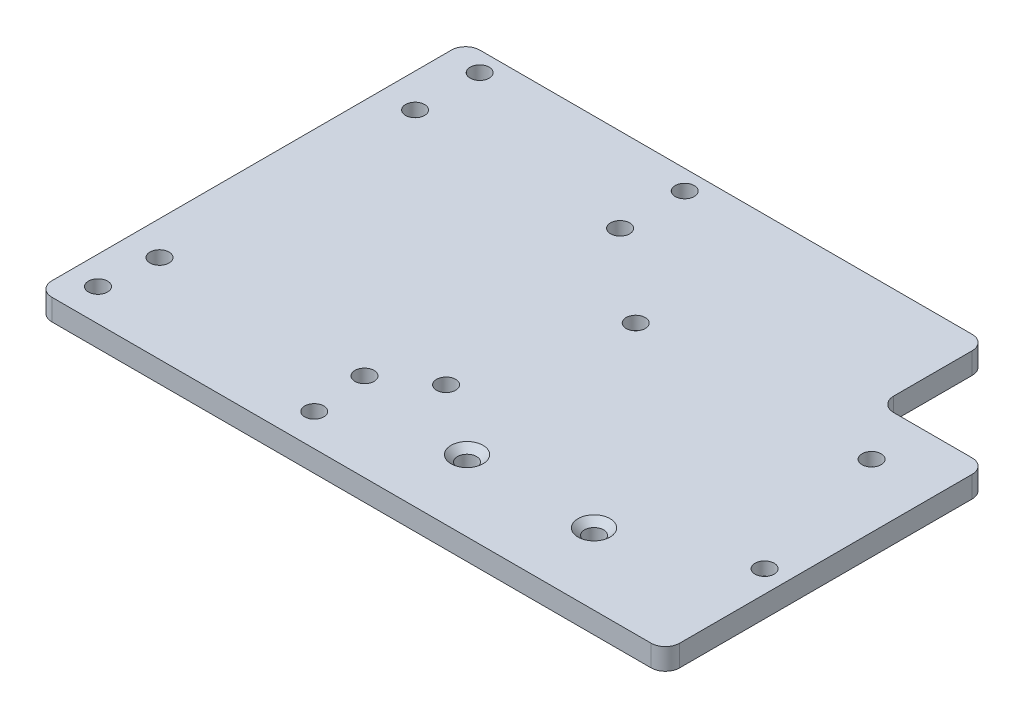
ISO-10303-21;
HEADER;
FILE_DESCRIPTION(('STEP AP214'),'2;1');
FILE_NAME('part.step','',(''),(''),'','','');
FILE_SCHEMA(('AUTOMOTIVE_DESIGN { 1 0 10303 214 1 1 1 1 }'));
ENDSEC;
DATA;
#1=APPLICATION_CONTEXT('core data for automotive mechanical design processes');
#2=APPLICATION_PROTOCOL_DEFINITION('international standard','automotive_design',2000,#1);
#3=PRODUCT_CONTEXT('',#1,'mechanical');
#4=PRODUCT('Part','Part','',(#3));
#5=PRODUCT_RELATED_PRODUCT_CATEGORY('part','',(#4));
#6=PRODUCT_DEFINITION_FORMATION('','',#4);
#7=PRODUCT_DEFINITION_CONTEXT('part definition',#1,'design');
#8=PRODUCT_DEFINITION('design','',#6,#7);
#9=PRODUCT_DEFINITION_SHAPE('','',#8);
#10=(LENGTH_UNIT() NAMED_UNIT(*) SI_UNIT(.MILLI.,.METRE.));
#11=(NAMED_UNIT(*) PLANE_ANGLE_UNIT() SI_UNIT($,.RADIAN.));
#12=(NAMED_UNIT(*) SI_UNIT($,.STERADIAN.) SOLID_ANGLE_UNIT());
#13=UNCERTAINTY_MEASURE_WITH_UNIT(LENGTH_MEASURE(1.E-05),#10,'distance_accuracy_value','');
#14=(GEOMETRIC_REPRESENTATION_CONTEXT(3) GLOBAL_UNCERTAINTY_ASSIGNED_CONTEXT((#13)) GLOBAL_UNIT_ASSIGNED_CONTEXT((#10,
#11,#12)) REPRESENTATION_CONTEXT('',''));
#15=CARTESIAN_POINT('',(0.,0.,0.));
#16=DIRECTION('',(0.,0.,1.));
#17=DIRECTION('',(1.,0.,0.));
#18=AXIS2_PLACEMENT_3D('',#15,#16,#17);
#19=CARTESIAN_POINT('',(55.88,1.905,38.1));
#20=DIRECTION('',(-1.,0.,0.));
#21=DIRECTION('',(0.,0.,1.));
#22=AXIS2_PLACEMENT_3D('',#19,#20,#21);
#23=PLANE('',#22);
#24=DIRECTION('',(0.,0.,-1.));
#25=VECTOR('',#24,1.);
#26=CARTESIAN_POINT('',(55.88,-1.905,38.1));
#27=LINE('',#26,#25);
#28=CARTESIAN_POINT('',(55.88,-1.905,35.56));
#29=VERTEX_POINT('',#28);
#30=CARTESIAN_POINT('',(55.88,-1.905,-16.51));
#31=VERTEX_POINT('',#30);
#32=EDGE_CURVE('E139',#29,#31,#27,.T.);
#33=ORIENTED_EDGE('',*,*,#32,.T.);
#34=DIRECTION('',(0.,1.,0.));
#35=VECTOR('',#34,1.);
#36=CARTESIAN_POINT('',(55.88,1.905,-16.51));
#37=LINE('',#36,#35);
#38=CARTESIAN_POINT('',(55.88,1.905,-16.51));
#39=VERTEX_POINT('',#38);
#40=EDGE_CURVE('E186',#31,#39,#37,.T.);
#41=ORIENTED_EDGE('',*,*,#40,.T.);
#42=DIRECTION('',(0.,0.,-1.));
#43=VECTOR('',#42,1.);
#44=CARTESIAN_POINT('',(55.88,1.905,38.1));
#45=LINE('',#44,#43);
#46=CARTESIAN_POINT('',(55.88,1.905,35.56));
#47=VERTEX_POINT('',#46);
#48=EDGE_CURVE('E142',#47,#39,#45,.T.);
#49=ORIENTED_EDGE('',*,*,#48,.F.);
#50=DIRECTION('',(0.,-1.,0.));
#51=VECTOR('',#50,1.);
#52=CARTESIAN_POINT('',(55.88,1.905,35.56));
#53=LINE('',#52,#51);
#54=EDGE_CURVE('E127',#47,#29,#53,.T.);
#55=ORIENTED_EDGE('',*,*,#54,.T.);
#56=EDGE_LOOP('',(#33,#41,#49,#55));
#57=FACE_BOUND('',#56,.T.);
#58=ADVANCED_FACE('F34',(#57),#23,.F.);
#59=CARTESIAN_POINT('',(-55.88,1.905,-38.1));
#60=DIRECTION('',(0.,0.,1.));
#61=DIRECTION('',(1.,0.,0.));
#62=AXIS2_PLACEMENT_3D('',#59,#60,#61);
#63=PLANE('',#62);
#64=DIRECTION('',(-1.,0.,0.));
#65=VECTOR('',#64,1.);
#66=CARTESIAN_POINT('',(-55.88,1.905,-38.1));
#67=LINE('',#66,#65);
#68=CARTESIAN_POINT('',(34.29,1.905,-38.1));
#69=VERTEX_POINT('',#68);
#70=CARTESIAN_POINT('',(-53.34,1.905,-38.1));
#71=VERTEX_POINT('',#70);
#72=EDGE_CURVE('E321',#69,#71,#67,.T.);
#73=ORIENTED_EDGE('',*,*,#72,.F.);
#74=DIRECTION('',(0.,-1.,0.));
#75=VECTOR('',#74,1.);
#76=CARTESIAN_POINT('',(34.29,1.905,-38.1));
#77=LINE('',#76,#75);
#78=CARTESIAN_POINT('',(34.29,-1.905,-38.1));
#79=VERTEX_POINT('',#78);
#80=EDGE_CURVE('E203',#69,#79,#77,.T.);
#81=ORIENTED_EDGE('',*,*,#80,.T.);
#82=DIRECTION('',(-1.,0.,0.));
#83=VECTOR('',#82,1.);
#84=CARTESIAN_POINT('',(-55.88,-1.905,-38.1));
#85=LINE('',#84,#83);
#86=CARTESIAN_POINT('',(-53.34,-1.905,-38.1));
#87=VERTEX_POINT('',#86);
#88=EDGE_CURVE('E151',#79,#87,#85,.T.);
#89=ORIENTED_EDGE('',*,*,#88,.T.);
#90=DIRECTION('',(0.,-1.,0.));
#91=VECTOR('',#90,1.);
#92=CARTESIAN_POINT('',(-53.34,1.905,-38.1));
#93=LINE('',#92,#91);
#94=EDGE_CURVE('E178',#87,#71,#93,.F.);
#95=ORIENTED_EDGE('',*,*,#94,.T.);
#96=EDGE_LOOP('',(#73,#81,#89,#95));
#97=FACE_BOUND('',#96,.T.);
#98=ADVANCED_FACE('F344',(#97),#63,.F.);
#99=CARTESIAN_POINT('',(-55.88,1.905,38.1));
#100=DIRECTION('',(1.,0.,0.));
#101=DIRECTION('',(0.,0.,-1.));
#102=AXIS2_PLACEMENT_3D('',#99,#100,#101);
#103=PLANE('',#102);
#104=DIRECTION('',(0.,0.,1.));
#105=VECTOR('',#104,1.);
#106=CARTESIAN_POINT('',(-55.88,1.905,38.1));
#107=LINE('',#106,#105);
#108=CARTESIAN_POINT('',(-55.88,1.905,-35.56));
#109=VERTEX_POINT('',#108);
#110=CARTESIAN_POINT('',(-55.88,1.905,35.56));
#111=VERTEX_POINT('',#110);
#112=EDGE_CURVE('E322',#109,#111,#107,.T.);
#113=ORIENTED_EDGE('',*,*,#112,.F.);
#114=DIRECTION('',(0.,-1.,0.));
#115=VECTOR('',#114,1.);
#116=CARTESIAN_POINT('',(-55.88,1.905,-35.56));
#117=LINE('',#116,#115);
#118=CARTESIAN_POINT('',(-55.88,-1.905,-35.56));
#119=VERTEX_POINT('',#118);
#120=EDGE_CURVE('E183',#109,#119,#117,.T.);
#121=ORIENTED_EDGE('',*,*,#120,.T.);
#122=DIRECTION('',(0.,0.,1.));
#123=VECTOR('',#122,1.);
#124=CARTESIAN_POINT('',(-55.88,-1.905,38.1));
#125=LINE('',#124,#123);
#126=CARTESIAN_POINT('',(-55.88,-1.905,35.56));
#127=VERTEX_POINT('',#126);
#128=EDGE_CURVE('E154',#119,#127,#125,.T.);
#129=ORIENTED_EDGE('',*,*,#128,.T.);
#130=DIRECTION('',(0.,-1.,0.));
#131=VECTOR('',#130,1.);
#132=CARTESIAN_POINT('',(-55.88,1.905,35.56));
#133=LINE('',#132,#131);
#134=EDGE_CURVE('E181',#127,#111,#133,.F.);
#135=ORIENTED_EDGE('',*,*,#134,.T.);
#136=EDGE_LOOP('',(#113,#121,#129,#135));
#137=FACE_BOUND('',#136,.T.);
#138=ADVANCED_FACE('F336',(#137),#103,.F.);
#139=CARTESIAN_POINT('',(-55.88,1.905,38.1));
#140=DIRECTION('',(0.,0.,-1.));
#141=DIRECTION('',(-1.,0.,0.));
#142=AXIS2_PLACEMENT_3D('',#139,#140,#141);
#143=PLANE('',#142);
#144=DIRECTION('',(1.,0.,0.));
#145=VECTOR('',#144,1.);
#146=CARTESIAN_POINT('',(-55.88,-1.905,38.1));
#147=LINE('',#146,#145);
#148=CARTESIAN_POINT('',(-53.34,-1.905,38.1));
#149=VERTEX_POINT('',#148);
#150=CARTESIAN_POINT('',(53.34,-1.905,38.1));
#151=VERTEX_POINT('',#150);
#152=EDGE_CURVE('E164',#149,#151,#147,.T.);
#153=ORIENTED_EDGE('',*,*,#152,.T.);
#154=DIRECTION('',(0.,-1.,0.));
#155=VECTOR('',#154,1.);
#156=CARTESIAN_POINT('',(53.34,1.905,38.1));
#157=LINE('',#156,#155);
#158=CARTESIAN_POINT('',(53.34,1.905,38.1));
#159=VERTEX_POINT('',#158);
#160=EDGE_CURVE('E128',#151,#159,#157,.F.);
#161=ORIENTED_EDGE('',*,*,#160,.T.);
#162=DIRECTION('',(1.,0.,0.));
#163=VECTOR('',#162,1.);
#164=CARTESIAN_POINT('',(-55.88,1.905,38.1));
#165=LINE('',#164,#163);
#166=CARTESIAN_POINT('',(-53.34,1.905,38.1));
#167=VERTEX_POINT('',#166);
#168=EDGE_CURVE('E144',#167,#159,#165,.T.);
#169=ORIENTED_EDGE('',*,*,#168,.F.);
#170=DIRECTION('',(0.,-1.,0.));
#171=VECTOR('',#170,1.);
#172=CARTESIAN_POINT('',(-53.34,1.905,38.1));
#173=LINE('',#172,#171);
#174=EDGE_CURVE('E132',#167,#149,#173,.T.);
#175=ORIENTED_EDGE('',*,*,#174,.T.);
#176=EDGE_LOOP('',(#153,#161,#169,#175));
#177=FACE_BOUND('',#176,.T.);
#178=ADVANCED_FACE('F330',(#177),#143,.F.);
#179=CARTESIAN_POINT('',(0.,1.905,0.));
#180=DIRECTION('',(0.,-1.,0.));
#181=DIRECTION('',(0.,0.,-1.));
#182=AXIS2_PLACEMENT_3D('',#179,#180,#181);
#183=PLANE('',#182);
#184=CARTESIAN_POINT('',(30.4800000000001,1.905,25.3999999999999));
#185=DIRECTION('',(0.,-1.,0.));
#186=DIRECTION('',(0.,0.,-1.));
#187=AXIS2_PLACEMENT_3D('',#184,#185,#186);
#188=CIRCLE('',#187,2.85);
#189=CARTESIAN_POINT('',(30.4800000000001,1.905,22.5499999999999));
#190=VERTEX_POINT('',#189);
#191=EDGE_CURVE('E711',#190,#190,#188,.T.);
#192=ORIENTED_EDGE('',*,*,#191,.T.);
#193=EDGE_LOOP('',(#192));
#194=FACE_BOUND('',#193,.T.);
#195=CARTESIAN_POINT('',(7.87400000000006,1.905,25.3999999999999));
#196=DIRECTION('',(0.,-1.,0.));
#197=DIRECTION('',(0.,0.,-1.));
#198=AXIS2_PLACEMENT_3D('',#195,#196,#197);
#199=CIRCLE('',#198,2.85);
#200=CARTESIAN_POINT('',(7.87400000000006,1.905,22.5499999999999));
#201=VERTEX_POINT('',#200);
#202=EDGE_CURVE('E701',#201,#201,#199,.T.);
#203=ORIENTED_EDGE('',*,*,#202,.T.);
#204=EDGE_LOOP('',(#203));
#205=FACE_BOUND('',#204,.T.);
#206=CARTESIAN_POINT('',(-49.88,1.905,-23.1));
#207=DIRECTION('',(0.,-1.,0.));
#208=DIRECTION('',(0.,0.,-1.));
#209=AXIS2_PLACEMENT_3D('',#206,#207,#208);
#210=CIRCLE('',#209,1.7);
#211=CARTESIAN_POINT('',(-49.88,1.905,-24.8));
#212=VERTEX_POINT('',#211);
#213=EDGE_CURVE('E246',#212,#212,#210,.T.);
#214=ORIENTED_EDGE('',*,*,#213,.T.);
#215=EDGE_LOOP('',(#214));
#216=FACE_BOUND('',#215,.T.);
#217=CARTESIAN_POINT('',(-13.38,1.905,-23.1));
#218=DIRECTION('',(0.,-1.,0.));
#219=DIRECTION('',(0.,0.,-1.));
#220=AXIS2_PLACEMENT_3D('',#217,#218,#219);
#221=CIRCLE('',#220,1.7);
#222=CARTESIAN_POINT('',(-13.38,1.905,-24.8));
#223=VERTEX_POINT('',#222);
#224=EDGE_CURVE('E258',#223,#223,#221,.T.);
#225=ORIENTED_EDGE('',*,*,#224,.T.);
#226=EDGE_LOOP('',(#225));
#227=FACE_BOUND('',#226,.T.);
#228=CARTESIAN_POINT('',(51.9557000000001,1.905,16.5099999999999));
#229=DIRECTION('',(0.,-1.,0.));
#230=DIRECTION('',(0.,0.,-1.));
#231=AXIS2_PLACEMENT_3D('',#228,#229,#230);
#232=CIRCLE('',#231,1.7);
#233=CARTESIAN_POINT('',(51.9557000000001,1.905,14.8099999999999));
#234=VERTEX_POINT('',#233);
#235=EDGE_CURVE('E270',#234,#234,#232,.T.);
#236=ORIENTED_EDGE('',*,*,#235,.T.);
#237=EDGE_LOOP('',(#236));
#238=FACE_BOUND('',#237,.T.);
#239=CARTESIAN_POINT('',(-4.74471999999992,1.905,16.5099999999999));
#240=DIRECTION('',(0.,-1.,0.));
#241=DIRECTION('',(0.,0.,-1.));
#242=AXIS2_PLACEMENT_3D('',#239,#240,#241);
#243=CIRCLE('',#242,1.7);
#244=CARTESIAN_POINT('',(-4.74471999999992,1.905,14.8099999999999));
#245=VERTEX_POINT('',#244);
#246=EDGE_CURVE('E279',#245,#245,#243,.T.);
#247=ORIENTED_EDGE('',*,*,#246,.T.);
#248=EDGE_LOOP('',(#247));
#249=FACE_BOUND('',#248,.T.);
#250=CARTESIAN_POINT('',(44.6057,1.905,-9.89));
#251=DIRECTION('',(0.,-1.,0.));
#252=DIRECTION('',(0.,0.,-1.));
#253=AXIS2_PLACEMENT_3D('',#250,#251,#252);
#254=CIRCLE('',#253,1.7);
#255=CARTESIAN_POINT('',(44.6057,1.905,-11.59));
#256=VERTEX_POINT('',#255);
#257=EDGE_CURVE('E288',#256,#256,#254,.T.);
#258=ORIENTED_EDGE('',*,*,#257,.T.);
#259=EDGE_LOOP('',(#258));
#260=FACE_BOUND('',#259,.T.);
#261=CARTESIAN_POINT('',(2.60528000000002,1.905,-9.89));
#262=DIRECTION('',(0.,-1.,0.));
#263=DIRECTION('',(0.,0.,-1.));
#264=AXIS2_PLACEMENT_3D('',#261,#262,#263);
#265=CIRCLE('',#264,1.7);
#266=CARTESIAN_POINT('',(2.60528000000002,1.905,-11.59));
#267=VERTEX_POINT('',#266);
#268=EDGE_CURVE('E297',#267,#267,#265,.T.);
#269=ORIENTED_EDGE('',*,*,#268,.T.);
#270=EDGE_LOOP('',(#269));
#271=FACE_BOUND('',#270,.T.);
#272=CARTESIAN_POINT('',(-13.38,1.905,-34.6));
#273=DIRECTION('',(0.,-1.,0.));
#274=DIRECTION('',(0.,0.,-1.));
#275=AXIS2_PLACEMENT_3D('',#272,#273,#274);
#276=CIRCLE('',#275,1.7);
#277=CARTESIAN_POINT('',(-13.38,1.905,-36.3));
#278=VERTEX_POINT('',#277);
#279=EDGE_CURVE('E303',#278,#278,#276,.T.);
#280=ORIENTED_EDGE('',*,*,#279,.T.);
#281=EDGE_LOOP('',(#280));
#282=FACE_BOUND('',#281,.T.);
#283=CARTESIAN_POINT('',(-49.88,1.905,-34.6));
#284=DIRECTION('',(0.,-1.,0.));
#285=DIRECTION('',(0.,0.,-1.));
#286=AXIS2_PLACEMENT_3D('',#283,#284,#285);
#287=CIRCLE('',#286,1.7);
#288=CARTESIAN_POINT('',(-49.88,1.905,-36.3));
#289=VERTEX_POINT('',#288);
#290=EDGE_CURVE('E309',#289,#289,#287,.T.);
#291=ORIENTED_EDGE('',*,*,#290,.T.);
#292=EDGE_LOOP('',(#291));
#293=FACE_BOUND('',#292,.T.);
#294=CARTESIAN_POINT('',(-50.88,1.905,32.35));
#295=DIRECTION('',(0.,-1.,0.));
#296=DIRECTION('',(0.,0.,-1.));
#297=AXIS2_PLACEMENT_3D('',#294,#295,#296);
#298=CIRCLE('',#297,1.7);
#299=CARTESIAN_POINT('',(-50.88,1.905,30.65));
#300=VERTEX_POINT('',#299);
#301=EDGE_CURVE('E315',#300,#300,#298,.T.);
#302=ORIENTED_EDGE('',*,*,#301,.T.);
#303=EDGE_LOOP('',(#302));
#304=FACE_BOUND('',#303,.T.);
#305=CARTESIAN_POINT('',(-12.38,1.905,32.35));
#306=DIRECTION('',(0.,-1.,0.));
#307=DIRECTION('',(0.,0.,-1.));
#308=AXIS2_PLACEMENT_3D('',#305,#306,#307);
#309=CIRCLE('',#308,1.7);
#310=CARTESIAN_POINT('',(-12.38,1.905,30.65));
#311=VERTEX_POINT('',#310);
#312=EDGE_CURVE('E152',#311,#311,#309,.T.);
#313=ORIENTED_EDGE('',*,*,#312,.T.);
#314=EDGE_LOOP('',(#313));
#315=FACE_BOUND('',#314,.T.);
#316=ORIENTED_EDGE('',*,*,#48,.T.);
#317=CARTESIAN_POINT('',(53.34,1.905,-16.51));
#318=DIRECTION('',(0.,-1.,0.));
#319=DIRECTION('',(0.,0.,-1.));
#320=AXIS2_PLACEMENT_3D('',#317,#318,#319);
#321=CIRCLE('',#320,2.54);
#322=CARTESIAN_POINT('',(53.34,1.905,-19.05));
#323=VERTEX_POINT('',#322);
#324=EDGE_CURVE('E190',#39,#323,#321,.F.);
#325=ORIENTED_EDGE('',*,*,#324,.T.);
#326=DIRECTION('',(-1.,0.,0.));
#327=VECTOR('',#326,1.);
#328=CARTESIAN_POINT('',(65.1855457581832,1.905,-19.05));
#329=LINE('',#328,#327);
#330=CARTESIAN_POINT('',(39.3700000000001,1.905,-19.05));
#331=VERTEX_POINT('',#330);
#332=EDGE_CURVE('E226',#323,#331,#329,.T.);
#333=ORIENTED_EDGE('',*,*,#332,.T.);
#334=CARTESIAN_POINT('',(39.3700000000001,1.905,-21.59));
#335=DIRECTION('',(0.,-1.,0.));
#336=DIRECTION('',(0.,0.,-1.));
#337=AXIS2_PLACEMENT_3D('',#334,#335,#336);
#338=CIRCLE('',#337,2.54);
#339=CARTESIAN_POINT('',(36.8300000000001,1.905,-21.59));
#340=VERTEX_POINT('',#339);
#341=EDGE_CURVE('E11',#331,#340,#338,.T.);
#342=ORIENTED_EDGE('',*,*,#341,.T.);
#343=DIRECTION('',(0.,0.,-1.));
#344=VECTOR('',#343,1.);
#345=CARTESIAN_POINT('',(36.8300000000001,1.905,-44.4377955911824));
#346=LINE('',#345,#344);
#347=CARTESIAN_POINT('',(36.8300000000001,1.905,-35.56));
#348=VERTEX_POINT('',#347);
#349=EDGE_CURVE('E224',#340,#348,#346,.T.);
#350=ORIENTED_EDGE('',*,*,#349,.T.);
#351=CARTESIAN_POINT('',(34.29,1.905,-35.56));
#352=DIRECTION('',(0.,-1.,0.));
#353=DIRECTION('',(0.,0.,-1.));
#354=AXIS2_PLACEMENT_3D('',#351,#352,#353);
#355=CIRCLE('',#354,2.54);
#356=EDGE_CURVE('E188',#348,#69,#355,.F.);
#357=ORIENTED_EDGE('',*,*,#356,.T.);
#358=ORIENTED_EDGE('',*,*,#72,.T.);
#359=CARTESIAN_POINT('',(-53.34,1.905,-35.56));
#360=DIRECTION('',(0.,-1.,0.));
#361=DIRECTION('',(0.,0.,-1.));
#362=AXIS2_PLACEMENT_3D('',#359,#360,#361);
#363=CIRCLE('',#362,2.54);
#364=EDGE_CURVE('E174',#71,#109,#363,.F.);
#365=ORIENTED_EDGE('',*,*,#364,.T.);
#366=ORIENTED_EDGE('',*,*,#112,.T.);
#367=CARTESIAN_POINT('',(-53.34,1.905,35.56));
#368=DIRECTION('',(0.,-1.,0.));
#369=DIRECTION('',(0.,0.,-1.));
#370=AXIS2_PLACEMENT_3D('',#367,#368,#369);
#371=CIRCLE('',#370,2.54);
#372=EDGE_CURVE('E172',#111,#167,#371,.F.);
#373=ORIENTED_EDGE('',*,*,#372,.T.);
#374=ORIENTED_EDGE('',*,*,#168,.T.);
#375=CARTESIAN_POINT('',(53.34,1.905,35.56));
#376=DIRECTION('',(0.,-1.,0.));
#377=DIRECTION('',(0.,0.,-1.));
#378=AXIS2_PLACEMENT_3D('',#375,#376,#377);
#379=CIRCLE('',#378,2.54);
#380=EDGE_CURVE('E176',#159,#47,#379,.F.);
#381=ORIENTED_EDGE('',*,*,#380,.T.);
#382=EDGE_LOOP('',(#316,#325,#333,#342,#350,#357,#358,#365,#366,#373,#374,#381));
#383=FACE_BOUND('',#382,.T.);
#384=CARTESIAN_POINT('',(-13.38,1.905,22.4));
#385=DIRECTION('',(0.,-1.,0.));
#386=DIRECTION('',(0.,0.,-1.));
#387=AXIS2_PLACEMENT_3D('',#384,#385,#386);
#388=CIRCLE('',#387,1.7);
#389=CARTESIAN_POINT('',(-13.38,1.905,20.7));
#390=VERTEX_POINT('',#389);
#391=EDGE_CURVE('E261',#390,#390,#388,.T.);
#392=ORIENTED_EDGE('',*,*,#391,.T.);
#393=EDGE_LOOP('',(#392));
#394=FACE_BOUND('',#393,.T.);
#395=CARTESIAN_POINT('',(-49.88,1.905,22.4));
#396=DIRECTION('',(0.,-1.,0.));
#397=DIRECTION('',(0.,0.,-1.));
#398=AXIS2_PLACEMENT_3D('',#395,#396,#397);
#399=CIRCLE('',#398,1.7);
#400=CARTESIAN_POINT('',(-49.88,1.905,20.7));
#401=VERTEX_POINT('',#400);
#402=EDGE_CURVE('E249',#401,#401,#399,.T.);
#403=ORIENTED_EDGE('',*,*,#402,.T.);
#404=EDGE_LOOP('',(#403));
#405=FACE_BOUND('',#404,.T.);
#406=ADVANCED_FACE('F222',(#194,#205,#216,#227,#238,#249,#260,#271,#282,#293,#304,#315,#383,
#394,#405),#183,.F.);
#407=CARTESIAN_POINT('',(0.,-1.905,0.));
#408=DIRECTION('',(0.,-1.,0.));
#409=DIRECTION('',(0.,0.,-1.));
#410=AXIS2_PLACEMENT_3D('',#407,#408,#409);
#411=PLANE('',#410);
#412=CARTESIAN_POINT('',(30.4800000000001,-1.905,25.3999999999999));
#413=DIRECTION('',(0.,-1.,0.));
#414=DIRECTION('',(0.,0.,-1.));
#415=AXIS2_PLACEMENT_3D('',#412,#413,#414);
#416=CIRCLE('',#415,1.7);
#417=CARTESIAN_POINT('',(30.4800000000001,-1.905,23.6999999999999));
#418=VERTEX_POINT('',#417);
#419=EDGE_CURVE('E696',#418,#418,#416,.T.);
#420=ORIENTED_EDGE('',*,*,#419,.F.);
#421=EDGE_LOOP('',(#420));
#422=FACE_BOUND('',#421,.T.);
#423=CARTESIAN_POINT('',(7.87400000000006,-1.905,25.3999999999999));
#424=DIRECTION('',(0.,-1.,0.));
#425=DIRECTION('',(0.,0.,-1.));
#426=AXIS2_PLACEMENT_3D('',#423,#424,#425);
#427=CIRCLE('',#426,1.7);
#428=CARTESIAN_POINT('',(7.87400000000006,-1.905,23.6999999999999));
#429=VERTEX_POINT('',#428);
#430=EDGE_CURVE('E699',#429,#429,#427,.T.);
#431=ORIENTED_EDGE('',*,*,#430,.F.);
#432=EDGE_LOOP('',(#431));
#433=FACE_BOUND('',#432,.T.);
#434=DIRECTION('',(-1.,0.,0.));
#435=VECTOR('',#434,1.);
#436=CARTESIAN_POINT('',(65.1855457581832,-1.905,-19.05));
#437=LINE('',#436,#435);
#438=CARTESIAN_POINT('',(53.34,-1.905,-19.05));
#439=VERTEX_POINT('',#438);
#440=CARTESIAN_POINT('',(39.3700000000001,-1.905,-19.05));
#441=VERTEX_POINT('',#440);
#442=EDGE_CURVE('E205',#439,#441,#437,.T.);
#443=ORIENTED_EDGE('',*,*,#442,.F.);
#444=CARTESIAN_POINT('',(53.34,-1.905,-16.51));
#445=DIRECTION('',(0.,-1.,0.));
#446=DIRECTION('',(0.,0.,-1.));
#447=AXIS2_PLACEMENT_3D('',#444,#445,#446);
#448=CIRCLE('',#447,2.54);
#449=EDGE_CURVE('E150',#439,#31,#448,.T.);
#450=ORIENTED_EDGE('',*,*,#449,.T.);
#451=ORIENTED_EDGE('',*,*,#32,.F.);
#452=CARTESIAN_POINT('',(53.34,-1.905,35.56));
#453=DIRECTION('',(0.,-1.,0.));
#454=DIRECTION('',(0.,0.,-1.));
#455=AXIS2_PLACEMENT_3D('',#452,#453,#454);
#456=CIRCLE('',#455,2.54);
#457=EDGE_CURVE('E123',#29,#151,#456,.T.);
#458=ORIENTED_EDGE('',*,*,#457,.T.);
#459=ORIENTED_EDGE('',*,*,#152,.F.);
#460=CARTESIAN_POINT('',(-53.34,-1.905,35.56));
#461=DIRECTION('',(0.,-1.,0.));
#462=DIRECTION('',(0.,0.,-1.));
#463=AXIS2_PLACEMENT_3D('',#460,#461,#462);
#464=CIRCLE('',#463,2.54);
#465=EDGE_CURVE('E143',#149,#127,#464,.T.);
#466=ORIENTED_EDGE('',*,*,#465,.T.);
#467=ORIENTED_EDGE('',*,*,#128,.F.);
#468=CARTESIAN_POINT('',(-53.34,-1.905,-35.56));
#469=DIRECTION('',(0.,-1.,0.));
#470=DIRECTION('',(0.,0.,-1.));
#471=AXIS2_PLACEMENT_3D('',#468,#469,#470);
#472=CIRCLE('',#471,2.54);
#473=EDGE_CURVE('E133',#119,#87,#472,.T.);
#474=ORIENTED_EDGE('',*,*,#473,.T.);
#475=ORIENTED_EDGE('',*,*,#88,.F.);
#476=CARTESIAN_POINT('',(34.29,-1.905,-35.56));
#477=DIRECTION('',(0.,-1.,0.));
#478=DIRECTION('',(0.,0.,-1.));
#479=AXIS2_PLACEMENT_3D('',#476,#477,#478);
#480=CIRCLE('',#479,2.54);
#481=CARTESIAN_POINT('',(36.8300000000001,-1.905,-35.56));
#482=VERTEX_POINT('',#481);
#483=EDGE_CURVE('E49',#79,#482,#480,.T.);
#484=ORIENTED_EDGE('',*,*,#483,.T.);
#485=DIRECTION('',(0.,0.,-1.));
#486=VECTOR('',#485,1.);
#487=CARTESIAN_POINT('',(36.8300000000001,-1.905,-44.4377955911824));
#488=LINE('',#487,#486);
#489=CARTESIAN_POINT('',(36.8300000000001,-1.905,-21.59));
#490=VERTEX_POINT('',#489);
#491=EDGE_CURVE('E206',#490,#482,#488,.T.);
#492=ORIENTED_EDGE('',*,*,#491,.F.);
#493=CARTESIAN_POINT('',(39.3700000000001,-1.905,-21.59));
#494=DIRECTION('',(0.,-1.,0.));
#495=DIRECTION('',(0.,0.,-1.));
#496=AXIS2_PLACEMENT_3D('',#493,#494,#495);
#497=CIRCLE('',#496,2.54);
#498=EDGE_CURVE('E42',#490,#441,#497,.F.);
#499=ORIENTED_EDGE('',*,*,#498,.T.);
#500=EDGE_LOOP('',(#443,#450,#451,#458,#459,#466,#467,#474,#475,#484,#492,#499));
#501=FACE_BOUND('',#500,.T.);
#502=CARTESIAN_POINT('',(-49.88,-1.905,-23.1));
#503=DIRECTION('',(0.,-1.,0.));
#504=DIRECTION('',(0.,0.,-1.));
#505=AXIS2_PLACEMENT_3D('',#502,#503,#504);
#506=CIRCLE('',#505,3.15);
#507=CARTESIAN_POINT('',(-49.88,-1.905,-26.25));
#508=VERTEX_POINT('',#507);
#509=EDGE_CURVE('E240',#508,#508,#506,.T.);
#510=ORIENTED_EDGE('',*,*,#509,.F.);
#511=EDGE_LOOP('',(#510));
#512=FACE_BOUND('',#511,.T.);
#513=CARTESIAN_POINT('',(-13.38,-1.905,-23.1));
#514=DIRECTION('',(0.,-1.,0.));
#515=DIRECTION('',(0.,0.,-1.));
#516=AXIS2_PLACEMENT_3D('',#513,#514,#515);
#517=CIRCLE('',#516,3.15);
#518=CARTESIAN_POINT('',(-13.38,-1.905,-26.25));
#519=VERTEX_POINT('',#518);
#520=EDGE_CURVE('E252',#519,#519,#517,.T.);
#521=ORIENTED_EDGE('',*,*,#520,.F.);
#522=EDGE_LOOP('',(#521));
#523=FACE_BOUND('',#522,.T.);
#524=CARTESIAN_POINT('',(51.9557000000001,-1.905,16.5099999999999));
#525=DIRECTION('',(0.,-1.,0.));
#526=DIRECTION('',(0.,0.,-1.));
#527=AXIS2_PLACEMENT_3D('',#524,#525,#526);
#528=CIRCLE('',#527,3.15);
#529=CARTESIAN_POINT('',(51.9557000000001,-1.905,13.3599999999999));
#530=VERTEX_POINT('',#529);
#531=EDGE_CURVE('E264',#530,#530,#528,.T.);
#532=ORIENTED_EDGE('',*,*,#531,.F.);
#533=EDGE_LOOP('',(#532));
#534=FACE_BOUND('',#533,.T.);
#535=CARTESIAN_POINT('',(-4.74471999999992,-1.905,16.5099999999999));
#536=DIRECTION('',(0.,-1.,0.));
#537=DIRECTION('',(0.,0.,-1.));
#538=AXIS2_PLACEMENT_3D('',#535,#536,#537);
#539=CIRCLE('',#538,3.15);
#540=CARTESIAN_POINT('',(-4.74471999999992,-1.905,13.3599999999999));
#541=VERTEX_POINT('',#540);
#542=EDGE_CURVE('E273',#541,#541,#539,.T.);
#543=ORIENTED_EDGE('',*,*,#542,.F.);
#544=EDGE_LOOP('',(#543));
#545=FACE_BOUND('',#544,.T.);
#546=CARTESIAN_POINT('',(44.6057,-1.905,-9.89));
#547=DIRECTION('',(0.,-1.,0.));
#548=DIRECTION('',(0.,0.,-1.));
#549=AXIS2_PLACEMENT_3D('',#546,#547,#548);
#550=CIRCLE('',#549,3.15);
#551=CARTESIAN_POINT('',(44.6057,-1.905,-13.04));
#552=VERTEX_POINT('',#551);
#553=EDGE_CURVE('E282',#552,#552,#550,.T.);
#554=ORIENTED_EDGE('',*,*,#553,.F.);
#555=EDGE_LOOP('',(#554));
#556=FACE_BOUND('',#555,.T.);
#557=CARTESIAN_POINT('',(2.60528000000002,-1.905,-9.89));
#558=DIRECTION('',(0.,-1.,0.));
#559=DIRECTION('',(0.,0.,-1.));
#560=AXIS2_PLACEMENT_3D('',#557,#558,#559);
#561=CIRCLE('',#560,3.15);
#562=CARTESIAN_POINT('',(2.60528000000002,-1.905,-13.04));
#563=VERTEX_POINT('',#562);
#564=EDGE_CURVE('E291',#563,#563,#561,.T.);
#565=ORIENTED_EDGE('',*,*,#564,.F.);
#566=EDGE_LOOP('',(#565));
#567=FACE_BOUND('',#566,.T.);
#568=CARTESIAN_POINT('',(-13.38,-1.905,-34.6));
#569=DIRECTION('',(0.,-1.,0.));
#570=DIRECTION('',(0.,0.,-1.));
#571=AXIS2_PLACEMENT_3D('',#568,#569,#570);
#572=CIRCLE('',#571,1.69999999999999);
#573=CARTESIAN_POINT('',(-13.38,-1.905,-36.3));
#574=VERTEX_POINT('',#573);
#575=EDGE_CURVE('E300',#574,#574,#572,.T.);
#576=ORIENTED_EDGE('',*,*,#575,.F.);
#577=EDGE_LOOP('',(#576));
#578=FACE_BOUND('',#577,.T.);
#579=CARTESIAN_POINT('',(-49.88,-1.905,-34.6));
#580=DIRECTION('',(0.,-1.,0.));
#581=DIRECTION('',(0.,0.,-1.));
#582=AXIS2_PLACEMENT_3D('',#579,#580,#581);
#583=CIRCLE('',#582,1.69999999999999);
#584=CARTESIAN_POINT('',(-49.88,-1.905,-36.3));
#585=VERTEX_POINT('',#584);
#586=EDGE_CURVE('E306',#585,#585,#583,.T.);
#587=ORIENTED_EDGE('',*,*,#586,.F.);
#588=EDGE_LOOP('',(#587));
#589=FACE_BOUND('',#588,.T.);
#590=CARTESIAN_POINT('',(-50.88,-1.905,32.35));
#591=DIRECTION('',(0.,-1.,0.));
#592=DIRECTION('',(0.,0.,-1.));
#593=AXIS2_PLACEMENT_3D('',#590,#591,#592);
#594=CIRCLE('',#593,1.69999999999999);
#595=CARTESIAN_POINT('',(-50.88,-1.905,30.65));
#596=VERTEX_POINT('',#595);
#597=EDGE_CURVE('E312',#596,#596,#594,.T.);
#598=ORIENTED_EDGE('',*,*,#597,.F.);
#599=EDGE_LOOP('',(#598));
#600=FACE_BOUND('',#599,.T.);
#601=CARTESIAN_POINT('',(-12.38,-1.905,32.35));
#602=DIRECTION('',(0.,-1.,0.));
#603=DIRECTION('',(0.,0.,-1.));
#604=AXIS2_PLACEMENT_3D('',#601,#602,#603);
#605=CIRCLE('',#604,1.69999999999999);
#606=CARTESIAN_POINT('',(-12.38,-1.905,30.65));
#607=VERTEX_POINT('',#606);
#608=EDGE_CURVE('E157',#607,#607,#605,.T.);
#609=ORIENTED_EDGE('',*,*,#608,.F.);
#610=EDGE_LOOP('',(#609));
#611=FACE_BOUND('',#610,.T.);
#612=CARTESIAN_POINT('',(-13.38,-1.905,22.4));
#613=DIRECTION('',(0.,-1.,0.));
#614=DIRECTION('',(0.,0.,-1.));
#615=AXIS2_PLACEMENT_3D('',#612,#613,#614);
#616=CIRCLE('',#615,1.7);
#617=CARTESIAN_POINT('',(-13.38,-1.905,20.7));
#618=VERTEX_POINT('',#617);
#619=EDGE_CURVE('E232',#618,#618,#616,.T.);
#620=ORIENTED_EDGE('',*,*,#619,.F.);
#621=EDGE_LOOP('',(#620));
#622=FACE_BOUND('',#621,.T.);
#623=CARTESIAN_POINT('',(-49.88,-1.905,22.4));
#624=DIRECTION('',(0.,-1.,0.));
#625=DIRECTION('',(0.,0.,-1.));
#626=AXIS2_PLACEMENT_3D('',#623,#624,#625);
#627=CIRCLE('',#626,1.7);
#628=CARTESIAN_POINT('',(-49.88,-1.905,20.7));
#629=VERTEX_POINT('',#628);
#630=EDGE_CURVE('E229',#629,#629,#627,.T.);
#631=ORIENTED_EDGE('',*,*,#630,.F.);
#632=EDGE_LOOP('',(#631));
#633=FACE_BOUND('',#632,.T.);
#634=ADVANCED_FACE('F147',(#422,#433,#501,#512,#523,#534,#545,#556,#567,#578,#589,#600,#611,
#622,#633),#411,.T.);
#635=CARTESIAN_POINT('',(53.34,1.905,35.56));
#636=DIRECTION('',(0.,-1.,0.));
#637=DIRECTION('',(0.,0.,-1.));
#638=AXIS2_PLACEMENT_3D('',#635,#636,#637);
#639=CYLINDRICAL_SURFACE('',#638,2.54);
#640=ORIENTED_EDGE('',*,*,#380,.F.);
#641=ORIENTED_EDGE('',*,*,#160,.F.);
#642=ORIENTED_EDGE('',*,*,#457,.F.);
#643=ORIENTED_EDGE('',*,*,#54,.F.);
#644=EDGE_LOOP('',(#640,#641,#642,#643));
#645=FACE_BOUND('',#644,.T.);
#646=ADVANCED_FACE('F126',(#645),#639,.T.);
#647=CARTESIAN_POINT('',(-53.34,1.905,-35.56));
#648=DIRECTION('',(0.,-1.,0.));
#649=DIRECTION('',(0.,0.,-1.));
#650=AXIS2_PLACEMENT_3D('',#647,#648,#649);
#651=CYLINDRICAL_SURFACE('',#650,2.54);
#652=ORIENTED_EDGE('',*,*,#364,.F.);
#653=ORIENTED_EDGE('',*,*,#94,.F.);
#654=ORIENTED_EDGE('',*,*,#473,.F.);
#655=ORIENTED_EDGE('',*,*,#120,.F.);
#656=EDGE_LOOP('',(#652,#653,#654,#655));
#657=FACE_BOUND('',#656,.T.);
#658=ADVANCED_FACE('F340',(#657),#651,.T.);
#659=CARTESIAN_POINT('',(-53.34,1.905,35.56));
#660=DIRECTION('',(0.,-1.,0.));
#661=DIRECTION('',(0.,0.,-1.));
#662=AXIS2_PLACEMENT_3D('',#659,#660,#661);
#663=CYLINDRICAL_SURFACE('',#662,2.54);
#664=ORIENTED_EDGE('',*,*,#372,.F.);
#665=ORIENTED_EDGE('',*,*,#134,.F.);
#666=ORIENTED_EDGE('',*,*,#465,.F.);
#667=ORIENTED_EDGE('',*,*,#174,.F.);
#668=EDGE_LOOP('',(#664,#665,#666,#667));
#669=FACE_BOUND('',#668,.T.);
#670=ADVANCED_FACE('F332',(#669),#663,.T.);
#671=CARTESIAN_POINT('',(-12.38,-1.905,32.35));
#672=DIRECTION('',(0.,-1.,0.));
#673=DIRECTION('',(0.,0.,-1.));
#674=AXIS2_PLACEMENT_3D('',#671,#672,#673);
#675=CYLINDRICAL_SURFACE('',#674,1.69999999999999);
#676=ORIENTED_EDGE('',*,*,#312,.F.);
#677=EDGE_LOOP('',(#676));
#678=FACE_BOUND('',#677,.T.);
#679=ORIENTED_EDGE('',*,*,#608,.T.);
#680=EDGE_LOOP('',(#679));
#681=FACE_BOUND('',#680,.T.);
#682=ADVANCED_FACE('F364',(#678,#681),#675,.F.);
#683=CARTESIAN_POINT('',(-50.88,-1.905,32.35));
#684=DIRECTION('',(0.,-1.,0.));
#685=DIRECTION('',(0.,0.,-1.));
#686=AXIS2_PLACEMENT_3D('',#683,#684,#685);
#687=CYLINDRICAL_SURFACE('',#686,1.69999999999999);
#688=ORIENTED_EDGE('',*,*,#301,.F.);
#689=EDGE_LOOP('',(#688));
#690=FACE_BOUND('',#689,.T.);
#691=ORIENTED_EDGE('',*,*,#597,.T.);
#692=EDGE_LOOP('',(#691));
#693=FACE_BOUND('',#692,.T.);
#694=ADVANCED_FACE('F457',(#690,#693),#687,.F.);
#695=CARTESIAN_POINT('',(-49.88,-1.905,-34.6));
#696=DIRECTION('',(0.,-1.,0.));
#697=DIRECTION('',(0.,0.,-1.));
#698=AXIS2_PLACEMENT_3D('',#695,#696,#697);
#699=CYLINDRICAL_SURFACE('',#698,1.69999999999999);
#700=ORIENTED_EDGE('',*,*,#290,.F.);
#701=EDGE_LOOP('',(#700));
#702=FACE_BOUND('',#701,.T.);
#703=ORIENTED_EDGE('',*,*,#586,.T.);
#704=EDGE_LOOP('',(#703));
#705=FACE_BOUND('',#704,.T.);
#706=ADVANCED_FACE('F453',(#702,#705),#699,.F.);
#707=CARTESIAN_POINT('',(-13.38,-1.905,-34.6));
#708=DIRECTION('',(0.,-1.,0.));
#709=DIRECTION('',(0.,0.,-1.));
#710=AXIS2_PLACEMENT_3D('',#707,#708,#709);
#711=CYLINDRICAL_SURFACE('',#710,1.69999999999999);
#712=ORIENTED_EDGE('',*,*,#279,.F.);
#713=EDGE_LOOP('',(#712));
#714=FACE_BOUND('',#713,.T.);
#715=ORIENTED_EDGE('',*,*,#575,.T.);
#716=EDGE_LOOP('',(#715));
#717=FACE_BOUND('',#716,.T.);
#718=ADVANCED_FACE('F449',(#714,#717),#711,.F.);
#719=CARTESIAN_POINT('',(2.60528000000002,-1.905,-9.89));
#720=DIRECTION('',(0.,-1.,0.));
#721=DIRECTION('',(0.,0.,-1.));
#722=AXIS2_PLACEMENT_3D('',#719,#720,#721);
#723=CYLINDRICAL_SURFACE('',#722,1.7);
#724=ORIENTED_EDGE('',*,*,#268,.F.);
#725=EDGE_LOOP('',(#724));
#726=FACE_BOUND('',#725,.T.);
#727=CARTESIAN_POINT('',(2.60528000000002,-0.454999999999999,-9.89));
#728=DIRECTION('',(0.,-1.,0.));
#729=DIRECTION('',(0.,0.,-1.));
#730=AXIS2_PLACEMENT_3D('',#727,#728,#729);
#731=CIRCLE('',#730,1.7);
#732=CARTESIAN_POINT('',(2.60528000000002,-0.454999999999999,-11.59));
#733=VERTEX_POINT('',#732);
#734=EDGE_CURVE('E294',#733,#733,#731,.T.);
#735=ORIENTED_EDGE('',*,*,#734,.T.);
#736=EDGE_LOOP('',(#735));
#737=FACE_BOUND('',#736,.T.);
#738=ADVANCED_FACE('F445',(#726,#737),#723,.F.);
#739=CARTESIAN_POINT('',(2.60528000000002,-1.905,-9.89));
#740=DIRECTION('',(0.,-1.,0.));
#741=DIRECTION('',(0.,0.,-1.));
#742=AXIS2_PLACEMENT_3D('',#739,#740,#741);
#743=CONICAL_SURFACE('',#742,3.15,0.785398163397448);
#744=ORIENTED_EDGE('',*,*,#734,.F.);
#745=EDGE_LOOP('',(#744));
#746=FACE_BOUND('',#745,.T.);
#747=ORIENTED_EDGE('',*,*,#564,.T.);
#748=EDGE_LOOP('',(#747));
#749=FACE_BOUND('',#748,.T.);
#750=ADVANCED_FACE('F441',(#746,#749),#743,.F.);
#751=CARTESIAN_POINT('',(44.6057,-1.905,-9.89));
#752=DIRECTION('',(0.,-1.,0.));
#753=DIRECTION('',(0.,0.,-1.));
#754=AXIS2_PLACEMENT_3D('',#751,#752,#753);
#755=CYLINDRICAL_SURFACE('',#754,1.7);
#756=ORIENTED_EDGE('',*,*,#257,.F.);
#757=EDGE_LOOP('',(#756));
#758=FACE_BOUND('',#757,.T.);
#759=CARTESIAN_POINT('',(44.6057,-0.454999999999999,-9.89));
#760=DIRECTION('',(0.,-1.,0.));
#761=DIRECTION('',(0.,0.,-1.));
#762=AXIS2_PLACEMENT_3D('',#759,#760,#761);
#763=CIRCLE('',#762,1.7);
#764=CARTESIAN_POINT('',(44.6057,-0.454999999999999,-11.59));
#765=VERTEX_POINT('',#764);
#766=EDGE_CURVE('E285',#765,#765,#763,.T.);
#767=ORIENTED_EDGE('',*,*,#766,.T.);
#768=EDGE_LOOP('',(#767));
#769=FACE_BOUND('',#768,.T.);
#770=ADVANCED_FACE('F437',(#758,#769),#755,.F.);
#771=CARTESIAN_POINT('',(44.6057,-1.905,-9.89));
#772=DIRECTION('',(0.,-1.,0.));
#773=DIRECTION('',(0.,0.,-1.));
#774=AXIS2_PLACEMENT_3D('',#771,#772,#773);
#775=CONICAL_SURFACE('',#774,3.15,0.785398163397448);
#776=ORIENTED_EDGE('',*,*,#766,.F.);
#777=EDGE_LOOP('',(#776));
#778=FACE_BOUND('',#777,.T.);
#779=ORIENTED_EDGE('',*,*,#553,.T.);
#780=EDGE_LOOP('',(#779));
#781=FACE_BOUND('',#780,.T.);
#782=ADVANCED_FACE('F433',(#778,#781),#775,.F.);
#783=CARTESIAN_POINT('',(-4.74471999999992,-1.905,16.5099999999999));
#784=DIRECTION('',(0.,-1.,0.));
#785=DIRECTION('',(0.,0.,-1.));
#786=AXIS2_PLACEMENT_3D('',#783,#784,#785);
#787=CYLINDRICAL_SURFACE('',#786,1.7);
#788=ORIENTED_EDGE('',*,*,#246,.F.);
#789=EDGE_LOOP('',(#788));
#790=FACE_BOUND('',#789,.T.);
#791=CARTESIAN_POINT('',(-4.74471999999992,-0.454999999999999,16.5099999999999));
#792=DIRECTION('',(0.,-1.,0.));
#793=DIRECTION('',(0.,0.,-1.));
#794=AXIS2_PLACEMENT_3D('',#791,#792,#793);
#795=CIRCLE('',#794,1.7);
#796=CARTESIAN_POINT('',(-4.74471999999992,-0.454999999999999,14.8099999999999));
#797=VERTEX_POINT('',#796);
#798=EDGE_CURVE('E276',#797,#797,#795,.T.);
#799=ORIENTED_EDGE('',*,*,#798,.T.);
#800=EDGE_LOOP('',(#799));
#801=FACE_BOUND('',#800,.T.);
#802=ADVANCED_FACE('F429',(#790,#801),#787,.F.);
#803=CARTESIAN_POINT('',(-4.74471999999992,-1.905,16.5099999999999));
#804=DIRECTION('',(0.,-1.,0.));
#805=DIRECTION('',(0.,0.,-1.));
#806=AXIS2_PLACEMENT_3D('',#803,#804,#805);
#807=CONICAL_SURFACE('',#806,3.15,0.785398163397448);
#808=ORIENTED_EDGE('',*,*,#798,.F.);
#809=EDGE_LOOP('',(#808));
#810=FACE_BOUND('',#809,.T.);
#811=ORIENTED_EDGE('',*,*,#542,.T.);
#812=EDGE_LOOP('',(#811));
#813=FACE_BOUND('',#812,.T.);
#814=ADVANCED_FACE('F425',(#810,#813),#807,.F.);
#815=CARTESIAN_POINT('',(51.9557000000001,-1.905,16.5099999999999));
#816=DIRECTION('',(0.,-1.,0.));
#817=DIRECTION('',(0.,0.,-1.));
#818=AXIS2_PLACEMENT_3D('',#815,#816,#817);
#819=CYLINDRICAL_SURFACE('',#818,1.7);
#820=ORIENTED_EDGE('',*,*,#235,.F.);
#821=EDGE_LOOP('',(#820));
#822=FACE_BOUND('',#821,.T.);
#823=CARTESIAN_POINT('',(51.9557000000001,-0.454999999999999,16.5099999999999));
#824=DIRECTION('',(0.,-1.,0.));
#825=DIRECTION('',(0.,0.,-1.));
#826=AXIS2_PLACEMENT_3D('',#823,#824,#825);
#827=CIRCLE('',#826,1.7);
#828=CARTESIAN_POINT('',(51.9557000000001,-0.454999999999999,14.8099999999999));
#829=VERTEX_POINT('',#828);
#830=EDGE_CURVE('E267',#829,#829,#827,.T.);
#831=ORIENTED_EDGE('',*,*,#830,.T.);
#832=EDGE_LOOP('',(#831));
#833=FACE_BOUND('',#832,.T.);
#834=ADVANCED_FACE('F421',(#822,#833),#819,.F.);
#835=CARTESIAN_POINT('',(51.9557000000001,-1.905,16.5099999999999));
#836=DIRECTION('',(0.,-1.,0.));
#837=DIRECTION('',(0.,0.,-1.));
#838=AXIS2_PLACEMENT_3D('',#835,#836,#837);
#839=CONICAL_SURFACE('',#838,3.15,0.785398163397448);
#840=ORIENTED_EDGE('',*,*,#830,.F.);
#841=EDGE_LOOP('',(#840));
#842=FACE_BOUND('',#841,.T.);
#843=ORIENTED_EDGE('',*,*,#531,.T.);
#844=EDGE_LOOP('',(#843));
#845=FACE_BOUND('',#844,.T.);
#846=ADVANCED_FACE('F417',(#842,#845),#839,.F.);
#847=CARTESIAN_POINT('',(-13.38,-1.905,22.4));
#848=DIRECTION('',(0.,-1.,0.));
#849=DIRECTION('',(0.,0.,-1.));
#850=AXIS2_PLACEMENT_3D('',#847,#848,#849);
#851=CYLINDRICAL_SURFACE('',#850,1.7);
#852=ORIENTED_EDGE('',*,*,#391,.F.);
#853=EDGE_LOOP('',(#852));
#854=FACE_BOUND('',#853,.T.);
#855=ORIENTED_EDGE('',*,*,#619,.T.);
#856=EDGE_LOOP('',(#855));
#857=FACE_BOUND('',#856,.T.);
#858=ADVANCED_FACE('F413',(#854,#857),#851,.F.);
#859=CARTESIAN_POINT('',(-13.38,-1.905,-23.1));
#860=DIRECTION('',(0.,-1.,0.));
#861=DIRECTION('',(0.,0.,-1.));
#862=AXIS2_PLACEMENT_3D('',#859,#860,#861);
#863=CYLINDRICAL_SURFACE('',#862,1.7);
#864=ORIENTED_EDGE('',*,*,#224,.F.);
#865=EDGE_LOOP('',(#864));
#866=FACE_BOUND('',#865,.T.);
#867=CARTESIAN_POINT('',(-13.38,-0.454999999999999,-23.1));
#868=DIRECTION('',(0.,-1.,0.));
#869=DIRECTION('',(0.,0.,-1.));
#870=AXIS2_PLACEMENT_3D('',#867,#868,#869);
#871=CIRCLE('',#870,1.7);
#872=CARTESIAN_POINT('',(-13.38,-0.454999999999999,-24.8));
#873=VERTEX_POINT('',#872);
#874=EDGE_CURVE('E255',#873,#873,#871,.T.);
#875=ORIENTED_EDGE('',*,*,#874,.T.);
#876=EDGE_LOOP('',(#875));
#877=FACE_BOUND('',#876,.T.);
#878=ADVANCED_FACE('F409',(#866,#877),#863,.F.);
#879=CARTESIAN_POINT('',(-13.38,-1.905,-23.1));
#880=DIRECTION('',(0.,-1.,0.));
#881=DIRECTION('',(0.,0.,-1.));
#882=AXIS2_PLACEMENT_3D('',#879,#880,#881);
#883=CONICAL_SURFACE('',#882,3.15,0.785398163397448);
#884=ORIENTED_EDGE('',*,*,#874,.F.);
#885=EDGE_LOOP('',(#884));
#886=FACE_BOUND('',#885,.T.);
#887=ORIENTED_EDGE('',*,*,#520,.T.);
#888=EDGE_LOOP('',(#887));
#889=FACE_BOUND('',#888,.T.);
#890=ADVANCED_FACE('F405',(#886,#889),#883,.F.);
#891=CARTESIAN_POINT('',(-49.88,-1.905,22.4));
#892=DIRECTION('',(0.,-1.,0.));
#893=DIRECTION('',(0.,0.,-1.));
#894=AXIS2_PLACEMENT_3D('',#891,#892,#893);
#895=CYLINDRICAL_SURFACE('',#894,1.7);
#896=ORIENTED_EDGE('',*,*,#402,.F.);
#897=EDGE_LOOP('',(#896));
#898=FACE_BOUND('',#897,.T.);
#899=ORIENTED_EDGE('',*,*,#630,.T.);
#900=EDGE_LOOP('',(#899));
#901=FACE_BOUND('',#900,.T.);
#902=ADVANCED_FACE('F401',(#898,#901),#895,.F.);
#903=CARTESIAN_POINT('',(-49.88,-1.905,-23.1));
#904=DIRECTION('',(0.,-1.,0.));
#905=DIRECTION('',(0.,0.,-1.));
#906=AXIS2_PLACEMENT_3D('',#903,#904,#905);
#907=CYLINDRICAL_SURFACE('',#906,1.7);
#908=ORIENTED_EDGE('',*,*,#213,.F.);
#909=EDGE_LOOP('',(#908));
#910=FACE_BOUND('',#909,.T.);
#911=CARTESIAN_POINT('',(-49.88,-0.454999999999999,-23.1));
#912=DIRECTION('',(0.,-1.,0.));
#913=DIRECTION('',(0.,0.,-1.));
#914=AXIS2_PLACEMENT_3D('',#911,#912,#913);
#915=CIRCLE('',#914,1.7);
#916=CARTESIAN_POINT('',(-49.88,-0.454999999999999,-24.8));
#917=VERTEX_POINT('',#916);
#918=EDGE_CURVE('E243',#917,#917,#915,.T.);
#919=ORIENTED_EDGE('',*,*,#918,.T.);
#920=EDGE_LOOP('',(#919));
#921=FACE_BOUND('',#920,.T.);
#922=ADVANCED_FACE('F397',(#910,#921),#907,.F.);
#923=CARTESIAN_POINT('',(-49.88,-1.905,-23.1));
#924=DIRECTION('',(0.,-1.,0.));
#925=DIRECTION('',(0.,0.,-1.));
#926=AXIS2_PLACEMENT_3D('',#923,#924,#925);
#927=CONICAL_SURFACE('',#926,3.15,0.785398163397448);
#928=ORIENTED_EDGE('',*,*,#918,.F.);
#929=EDGE_LOOP('',(#928));
#930=FACE_BOUND('',#929,.T.);
#931=ORIENTED_EDGE('',*,*,#509,.T.);
#932=EDGE_LOOP('',(#931));
#933=FACE_BOUND('',#932,.T.);
#934=ADVANCED_FACE('F392',(#930,#933),#927,.F.);
#935=CARTESIAN_POINT('',(36.8300000000001,1.905,-44.4377955911824));
#936=DIRECTION('',(-1.,0.,0.));
#937=DIRECTION('',(0.,0.,1.));
#938=AXIS2_PLACEMENT_3D('',#935,#936,#937);
#939=PLANE('',#938);
#940=ORIENTED_EDGE('',*,*,#349,.F.);
#941=DIRECTION('',(0.,-1.,0.));
#942=VECTOR('',#941,1.);
#943=CARTESIAN_POINT('',(36.8300000000001,-1.905,-21.59));
#944=LINE('',#943,#942);
#945=EDGE_CURVE('E200',#340,#490,#944,.T.);
#946=ORIENTED_EDGE('',*,*,#945,.T.);
#947=ORIENTED_EDGE('',*,*,#491,.T.);
#948=DIRECTION('',(0.,-1.,0.));
#949=VECTOR('',#948,1.);
#950=CARTESIAN_POINT('',(36.8300000000001,1.905,-35.56));
#951=LINE('',#950,#949);
#952=EDGE_CURVE('E198',#482,#348,#951,.F.);
#953=ORIENTED_EDGE('',*,*,#952,.T.);
#954=EDGE_LOOP('',(#940,#946,#947,#953));
#955=FACE_BOUND('',#954,.T.);
#956=ADVANCED_FACE('F228',(#955),#939,.F.);
#957=CARTESIAN_POINT('',(65.1855457581832,1.905,-19.05));
#958=DIRECTION('',(0.,0.,1.));
#959=DIRECTION('',(1.,0.,0.));
#960=AXIS2_PLACEMENT_3D('',#957,#958,#959);
#961=PLANE('',#960);
#962=ORIENTED_EDGE('',*,*,#332,.F.);
#963=DIRECTION('',(0.,1.,0.));
#964=VECTOR('',#963,1.);
#965=CARTESIAN_POINT('',(53.34,1.905,-19.05));
#966=LINE('',#965,#964);
#967=EDGE_CURVE('E194',#323,#439,#966,.F.);
#968=ORIENTED_EDGE('',*,*,#967,.T.);
#969=ORIENTED_EDGE('',*,*,#442,.T.);
#970=DIRECTION('',(0.,-1.,0.));
#971=VECTOR('',#970,1.);
#972=CARTESIAN_POINT('',(39.3700000000001,1.905,-19.05));
#973=LINE('',#972,#971);
#974=EDGE_CURVE('E192',#441,#331,#973,.F.);
#975=ORIENTED_EDGE('',*,*,#974,.T.);
#976=EDGE_LOOP('',(#962,#968,#969,#975));
#977=FACE_BOUND('',#976,.T.);
#978=ADVANCED_FACE('F212',(#977),#961,.F.);
#979=CARTESIAN_POINT('',(7.87400000000006,0.754999999999998,25.3999999999999));
#980=DIRECTION('',(0.,1.,0.));
#981=DIRECTION('',(0.,0.,1.));
#982=AXIS2_PLACEMENT_3D('',#979,#980,#981);
#983=CONICAL_SURFACE('',#982,1.7,0.785398163397446);
#984=ORIENTED_EDGE('',*,*,#202,.F.);
#985=EDGE_LOOP('',(#984));
#986=FACE_BOUND('',#985,.T.);
#987=CARTESIAN_POINT('',(7.87400000000006,0.754999999999998,25.3999999999999));
#988=DIRECTION('',(0.,-1.,0.));
#989=DIRECTION('',(0.,0.,-1.));
#990=AXIS2_PLACEMENT_3D('',#987,#988,#989);
#991=CIRCLE('',#990,1.7);
#992=CARTESIAN_POINT('',(7.87400000000006,0.754999999999998,23.6999999999999));
#993=VERTEX_POINT('',#992);
#994=EDGE_CURVE('E215',#993,#993,#991,.T.);
#995=ORIENTED_EDGE('',*,*,#994,.T.);
#996=EDGE_LOOP('',(#995));
#997=FACE_BOUND('',#996,.T.);
#998=ADVANCED_FACE('F385',(#986,#997),#983,.F.);
#999=CARTESIAN_POINT('',(7.87400000000006,-1.905,25.3999999999999));
#1000=DIRECTION('',(0.,-1.,0.));
#1001=DIRECTION('',(0.,0.,-1.));
#1002=AXIS2_PLACEMENT_3D('',#999,#1000,#1001);
#1003=CYLINDRICAL_SURFACE('',#1002,1.7);
#1004=ORIENTED_EDGE('',*,*,#994,.F.);
#1005=EDGE_LOOP('',(#1004));
#1006=FACE_BOUND('',#1005,.T.);
#1007=ORIENTED_EDGE('',*,*,#430,.T.);
#1008=EDGE_LOOP('',(#1007));
#1009=FACE_BOUND('',#1008,.T.);
#1010=ADVANCED_FACE('F377',(#1006,#1009),#1003,.F.);
#1011=CARTESIAN_POINT('',(30.4800000000001,0.754999999999998,25.3999999999999));
#1012=DIRECTION('',(0.,1.,0.));
#1013=DIRECTION('',(0.,0.,1.));
#1014=AXIS2_PLACEMENT_3D('',#1011,#1012,#1013);
#1015=CONICAL_SURFACE('',#1014,1.7,0.785398163397446);
#1016=ORIENTED_EDGE('',*,*,#191,.F.);
#1017=EDGE_LOOP('',(#1016));
#1018=FACE_BOUND('',#1017,.T.);
#1019=CARTESIAN_POINT('',(30.4800000000001,0.754999999999998,25.3999999999999));
#1020=DIRECTION('',(0.,-1.,0.));
#1021=DIRECTION('',(0.,0.,-1.));
#1022=AXIS2_PLACEMENT_3D('',#1019,#1020,#1021);
#1023=CIRCLE('',#1022,1.7);
#1024=CARTESIAN_POINT('',(30.4800000000001,0.754999999999998,23.6999999999999));
#1025=VERTEX_POINT('',#1024);
#1026=EDGE_CURVE('E705',#1025,#1025,#1023,.T.);
#1027=ORIENTED_EDGE('',*,*,#1026,.T.);
#1028=EDGE_LOOP('',(#1027));
#1029=FACE_BOUND('',#1028,.T.);
#1030=ADVANCED_FACE('F371',(#1018,#1029),#1015,.F.);
#1031=CARTESIAN_POINT('',(30.4800000000001,-1.905,25.3999999999999));
#1032=DIRECTION('',(0.,-1.,0.));
#1033=DIRECTION('',(0.,0.,-1.));
#1034=AXIS2_PLACEMENT_3D('',#1031,#1032,#1033);
#1035=CYLINDRICAL_SURFACE('',#1034,1.7);
#1036=ORIENTED_EDGE('',*,*,#1026,.F.);
#1037=EDGE_LOOP('',(#1036));
#1038=FACE_BOUND('',#1037,.T.);
#1039=ORIENTED_EDGE('',*,*,#419,.T.);
#1040=EDGE_LOOP('',(#1039));
#1041=FACE_BOUND('',#1040,.T.);
#1042=ADVANCED_FACE('F366',(#1038,#1041),#1035,.F.);
#1043=CARTESIAN_POINT('',(53.34,1.905,-16.51));
#1044=DIRECTION('',(0.,1.,0.));
#1045=DIRECTION('',(0.,0.,1.));
#1046=AXIS2_PLACEMENT_3D('',#1043,#1044,#1045);
#1047=CYLINDRICAL_SURFACE('',#1046,2.54);
#1048=ORIENTED_EDGE('',*,*,#449,.F.);
#1049=ORIENTED_EDGE('',*,*,#967,.F.);
#1050=ORIENTED_EDGE('',*,*,#324,.F.);
#1051=ORIENTED_EDGE('',*,*,#40,.F.);
#1052=EDGE_LOOP('',(#1048,#1049,#1050,#1051));
#1053=FACE_BOUND('',#1052,.T.);
#1054=ADVANCED_FACE('F349',(#1053),#1047,.T.);
#1055=CARTESIAN_POINT('',(39.3700000000001,1.905,-21.59));
#1056=DIRECTION('',(0.,1.,0.));
#1057=DIRECTION('',(0.,0.,1.));
#1058=AXIS2_PLACEMENT_3D('',#1055,#1056,#1057);
#1059=CYLINDRICAL_SURFACE('',#1058,2.54);
#1060=ORIENTED_EDGE('',*,*,#341,.F.);
#1061=ORIENTED_EDGE('',*,*,#974,.F.);
#1062=ORIENTED_EDGE('',*,*,#498,.F.);
#1063=ORIENTED_EDGE('',*,*,#945,.F.);
#1064=EDGE_LOOP('',(#1060,#1061,#1062,#1063));
#1065=FACE_BOUND('',#1064,.T.);
#1066=ADVANCED_FACE('F218',(#1065),#1059,.F.);
#1067=CARTESIAN_POINT('',(34.29,1.905,-35.56));
#1068=DIRECTION('',(0.,-1.,0.));
#1069=DIRECTION('',(0.,0.,-1.));
#1070=AXIS2_PLACEMENT_3D('',#1067,#1068,#1069);
#1071=CYLINDRICAL_SURFACE('',#1070,2.54);
#1072=ORIENTED_EDGE('',*,*,#356,.F.);
#1073=ORIENTED_EDGE('',*,*,#952,.F.);
#1074=ORIENTED_EDGE('',*,*,#483,.F.);
#1075=ORIENTED_EDGE('',*,*,#80,.F.);
#1076=EDGE_LOOP('',(#1072,#1073,#1074,#1075));
#1077=FACE_BOUND('',#1076,.T.);
#1078=ADVANCED_FACE('F36',(#1077),#1071,.T.);
#1079=CLOSED_SHELL('',(#58,#98,#138,#178,#406,#634,#646,#658,#670,#682,#694,#706,#718,#738,#750,
#770,#782,#802,#814,#834,#846,#858,#878,#890,#902,#922,#934,#956,#978,#998,#1010,#1030,#1042,
#1054,#1066,#1078));
#1080=MANIFOLD_SOLID_BREP('B2',#1079);
#1081=ADVANCED_BREP_SHAPE_REPRESENTATION('',(#18,#1080),#14);
#1082=SHAPE_DEFINITION_REPRESENTATION(#9,#1081);
ENDSEC;
END-ISO-10303-21;
